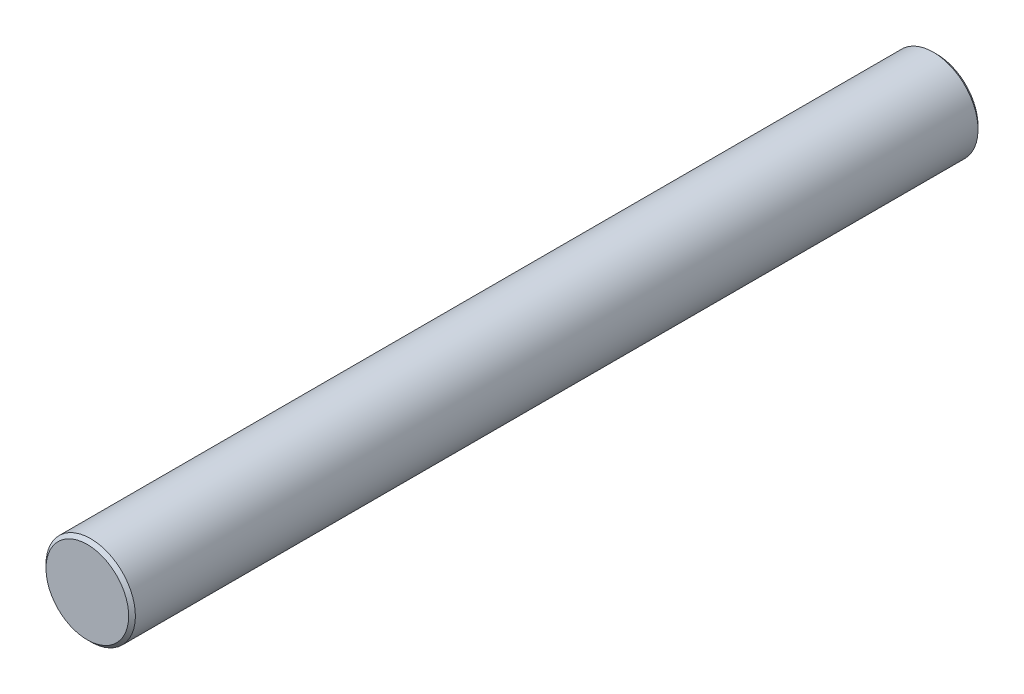
ISO-10303-21;
HEADER;
FILE_DESCRIPTION(('STEP AP214'),'2;1');
FILE_NAME('part.step','',(''),(''),'','','');
FILE_SCHEMA(('AUTOMOTIVE_DESIGN { 1 0 10303 214 1 1 1 1 }'));
ENDSEC;
DATA;
#1=APPLICATION_CONTEXT('core data for automotive mechanical design processes');
#2=APPLICATION_PROTOCOL_DEFINITION('international standard','automotive_design',2000,#1);
#3=PRODUCT_CONTEXT('',#1,'mechanical');
#4=PRODUCT('Part','Part','',(#3));
#5=PRODUCT_RELATED_PRODUCT_CATEGORY('part','',(#4));
#6=PRODUCT_DEFINITION_FORMATION('','',#4);
#7=PRODUCT_DEFINITION_CONTEXT('part definition',#1,'design');
#8=PRODUCT_DEFINITION('design','',#6,#7);
#9=PRODUCT_DEFINITION_SHAPE('','',#8);
#10=(LENGTH_UNIT() NAMED_UNIT(*) SI_UNIT(.MILLI.,.METRE.));
#11=(NAMED_UNIT(*) PLANE_ANGLE_UNIT() SI_UNIT($,.RADIAN.));
#12=(NAMED_UNIT(*) SI_UNIT($,.STERADIAN.) SOLID_ANGLE_UNIT());
#13=UNCERTAINTY_MEASURE_WITH_UNIT(LENGTH_MEASURE(1.E-05),#10,'distance_accuracy_value','');
#14=(GEOMETRIC_REPRESENTATION_CONTEXT(3) GLOBAL_UNCERTAINTY_ASSIGNED_CONTEXT((#13)) GLOBAL_UNIT_ASSIGNED_CONTEXT((#10,
#11,#12)) REPRESENTATION_CONTEXT('',''));
#15=CARTESIAN_POINT('',(0.,0.,0.));
#16=DIRECTION('',(0.,0.,1.));
#17=DIRECTION('',(1.,0.,0.));
#18=AXIS2_PLACEMENT_3D('',#15,#16,#17);
#19=CARTESIAN_POINT('',(0.,9.25,0.));
#20=DIRECTION('',(0.,0.,-1.));
#21=DIRECTION('',(0.,1.,0.));
#22=AXIS2_PLACEMENT_3D('',#19,#20,#21);
#23=PLANE('',#22);
#24=CARTESIAN_POINT('',(0.,0.,0.));
#25=DIRECTION('',(0.,0.,-1.));
#26=DIRECTION('',(0.,1.,0.));
#27=AXIS2_PLACEMENT_3D('',#24,#25,#26);
#28=CIRCLE('',#27,18.5);
#29=CARTESIAN_POINT('',(0.,18.5,0.));
#30=VERTEX_POINT('',#29);
#31=EDGE_CURVE('E9',#30,#30,#28,.T.);
#32=ORIENTED_EDGE('',*,*,#31,.T.);
#33=EDGE_LOOP('',(#32));
#34=FACE_BOUND('',#33,.T.);
#35=CARTESIAN_POINT('',(0.,0.,0.));
#36=DIRECTION('',(0.,0.,1.));
#37=DIRECTION('',(-1.,0.,0.));
#38=AXIS2_PLACEMENT_3D('',#35,#36,#37);
#39=CIRCLE('',#38,6.);
#40=CARTESIAN_POINT('',(-6.,0.,0.));
#41=VERTEX_POINT('',#40);
#42=EDGE_CURVE('E52',#41,#41,#39,.T.);
#43=ORIENTED_EDGE('',*,*,#42,.T.);
#44=EDGE_LOOP('',(#43));
#45=FACE_BOUND('',#44,.T.);
#46=ADVANCED_FACE('F15',(#34,#45),#23,.T.);
#47=CARTESIAN_POINT('',(0.,0.,0.75));
#48=DIRECTION('',(0.,0.,1.));
#49=DIRECTION('',(0.,1.,0.));
#50=AXIS2_PLACEMENT_3D('',#47,#48,#49);
#51=CONICAL_SURFACE('',#50,19.25,0.785398163397448);
#52=CARTESIAN_POINT('',(0.,0.,1.5));
#53=DIRECTION('',(0.,0.,-1.));
#54=DIRECTION('',(0.,1.,0.));
#55=AXIS2_PLACEMENT_3D('',#52,#53,#54);
#56=CIRCLE('',#55,20.);
#57=CARTESIAN_POINT('',(0.,20.,1.5));
#58=VERTEX_POINT('',#57);
#59=EDGE_CURVE('E25',#58,#58,#56,.T.);
#60=ORIENTED_EDGE('',*,*,#59,.T.);
#61=EDGE_LOOP('',(#60));
#62=FACE_BOUND('',#61,.T.);
#63=ORIENTED_EDGE('',*,*,#31,.F.);
#64=EDGE_LOOP('',(#63));
#65=FACE_BOUND('',#64,.T.);
#66=ADVANCED_FACE('F121',(#62,#65),#51,.T.);
#67=CARTESIAN_POINT('',(0.,0.,190.));
#68=DIRECTION('',(0.,0.,1.));
#69=DIRECTION('',(0.,1.,0.));
#70=AXIS2_PLACEMENT_3D('',#67,#68,#69);
#71=CYLINDRICAL_SURFACE('',#70,20.);
#72=CARTESIAN_POINT('',(0.,0.,378.5));
#73=DIRECTION('',(0.,0.,-1.));
#74=DIRECTION('',(0.,1.,0.));
#75=AXIS2_PLACEMENT_3D('',#72,#73,#74);
#76=CIRCLE('',#75,20.);
#77=CARTESIAN_POINT('',(0.,20.,378.5));
#78=VERTEX_POINT('',#77);
#79=EDGE_CURVE('E19',#78,#78,#76,.T.);
#80=ORIENTED_EDGE('',*,*,#79,.T.);
#81=EDGE_LOOP('',(#80));
#82=FACE_BOUND('',#81,.T.);
#83=ORIENTED_EDGE('',*,*,#59,.F.);
#84=EDGE_LOOP('',(#83));
#85=FACE_BOUND('',#84,.T.);
#86=CARTESIAN_POINT('',(0.,0.,6.5));
#87=DIRECTION('',(0.,0.,-1.));
#88=DIRECTION('',(0.,1.,0.));
#89=AXIS2_PLACEMENT_3D('',#86,#87,#88);
#90=CIRCLE('',#89,20.);
#91=CARTESIAN_POINT('',(10.5356537528527,-17.,6.5));
#92=VERTEX_POINT('',#91);
#93=CARTESIAN_POINT('',(-10.5356537528527,-17.,6.5));
#94=VERTEX_POINT('',#93);
#95=EDGE_CURVE('E69',#92,#94,#90,.T.);
#96=ORIENTED_EDGE('',*,*,#95,.T.);
#97=DIRECTION('',(0.,0.,1.));
#98=VECTOR('',#97,1.);
#99=CARTESIAN_POINT('',(-10.5356537528527,-17.,8.25));
#100=LINE('',#99,#98);
#101=CARTESIAN_POINT('',(-10.5356537528527,-17.,10.));
#102=VERTEX_POINT('',#101);
#103=EDGE_CURVE('E62',#94,#102,#100,.T.);
#104=ORIENTED_EDGE('',*,*,#103,.T.);
#105=CARTESIAN_POINT('',(0.,0.,10.));
#106=DIRECTION('',(0.,0.,1.));
#107=DIRECTION('',(0.,1.,0.));
#108=AXIS2_PLACEMENT_3D('',#105,#106,#107);
#109=CIRCLE('',#108,20.);
#110=CARTESIAN_POINT('',(10.5356537528527,-17.,10.));
#111=VERTEX_POINT('',#110);
#112=EDGE_CURVE('E75',#102,#111,#109,.T.);
#113=ORIENTED_EDGE('',*,*,#112,.T.);
#114=DIRECTION('',(0.,0.,-1.));
#115=VECTOR('',#114,1.);
#116=CARTESIAN_POINT('',(10.5356537528527,-17.,8.25));
#117=LINE('',#116,#115);
#118=EDGE_CURVE('E60',#111,#92,#117,.T.);
#119=ORIENTED_EDGE('',*,*,#118,.T.);
#120=EDGE_LOOP('',(#96,#104,#113,#119));
#121=FACE_BOUND('',#120,.T.);
#122=ADVANCED_FACE('F17',(#82,#85,#121),#71,.T.);
#123=CARTESIAN_POINT('',(0.,0.,379.25));
#124=DIRECTION('',(0.,0.,-1.));
#125=DIRECTION('',(0.,1.,0.));
#126=AXIS2_PLACEMENT_3D('',#123,#124,#125);
#127=CONICAL_SURFACE('',#126,19.25,0.785398163397448);
#128=CARTESIAN_POINT('',(0.,0.,380.));
#129=DIRECTION('',(0.,0.,-1.));
#130=DIRECTION('',(0.,1.,0.));
#131=AXIS2_PLACEMENT_3D('',#128,#129,#130);
#132=CIRCLE('',#131,18.5);
#133=CARTESIAN_POINT('',(0.,18.5,380.));
#134=VERTEX_POINT('',#133);
#135=EDGE_CURVE('E44',#134,#134,#132,.T.);
#136=ORIENTED_EDGE('',*,*,#135,.T.);
#137=EDGE_LOOP('',(#136));
#138=FACE_BOUND('',#137,.T.);
#139=ORIENTED_EDGE('',*,*,#79,.F.);
#140=EDGE_LOOP('',(#139));
#141=FACE_BOUND('',#140,.T.);
#142=ADVANCED_FACE('F116',(#138,#141),#127,.T.);
#143=CARTESIAN_POINT('',(0.,9.25,380.));
#144=DIRECTION('',(0.,0.,1.));
#145=DIRECTION('',(0.,-1.,0.));
#146=AXIS2_PLACEMENT_3D('',#143,#144,#145);
#147=PLANE('',#146);
#148=ORIENTED_EDGE('',*,*,#135,.F.);
#149=EDGE_LOOP('',(#148));
#150=FACE_BOUND('',#149,.T.);
#151=ADVANCED_FACE('F110',(#150),#147,.T.);
#152=CARTESIAN_POINT('',(0.,0.,26.4586213285198));
#153=DIRECTION('',(0.,0.,-1.));
#154=DIRECTION('',(-1.,0.,0.));
#155=AXIS2_PLACEMENT_3D('',#152,#153,#154);
#156=CONICAL_SURFACE('',#155,2.52640625,1.0471975511966);
#157=CARTESIAN_POINT('',(0.,0.,25.));
#158=DIRECTION('',(0.,0.,1.));
#159=DIRECTION('',(-1.,0.,0.));
#160=AXIS2_PLACEMENT_3D('',#157,#158,#159);
#161=CIRCLE('',#160,5.0528125);
#162=CARTESIAN_POINT('',(-5.0528125,0.,25.));
#163=VERTEX_POINT('',#162);
#164=EDGE_CURVE('E51',#163,#163,#161,.T.);
#165=ORIENTED_EDGE('',*,*,#164,.F.);
#166=EDGE_LOOP('',(#165));
#167=FACE_BOUND('',#166,.T.);
#168=CARTESIAN_POINT('',(0.,0.,27.9172426570397));
#169=VERTEX_POINT('',#168);
#170=VERTEX_LOOP('',#169);
#171=FACE_BOUND('',#170,.T.);
#172=ADVANCED_FACE('F104',(#167,#171),#156,.F.);
#173=CARTESIAN_POINT('',(0.,0.,12.97359375));
#174=DIRECTION('',(0.,0.,-1.));
#175=DIRECTION('',(-1.,0.,0.));
#176=AXIS2_PLACEMENT_3D('',#173,#174,#175);
#177=CYLINDRICAL_SURFACE('',#176,5.0528125);
#178=CARTESIAN_POINT('',(0.,0.,0.9471875));
#179=DIRECTION('',(0.,0.,1.));
#180=DIRECTION('',(-1.,0.,0.));
#181=AXIS2_PLACEMENT_3D('',#178,#179,#180);
#182=CIRCLE('',#181,5.0528125);
#183=CARTESIAN_POINT('',(-5.0528125,0.,0.9471875));
#184=VERTEX_POINT('',#183);
#185=EDGE_CURVE('E57',#184,#184,#182,.T.);
#186=ORIENTED_EDGE('',*,*,#185,.F.);
#187=EDGE_LOOP('',(#186));
#188=FACE_BOUND('',#187,.T.);
#189=ORIENTED_EDGE('',*,*,#164,.T.);
#190=EDGE_LOOP('',(#189));
#191=FACE_BOUND('',#190,.T.);
#192=ADVANCED_FACE('F101',(#188,#191),#177,.F.);
#193=CARTESIAN_POINT('',(0.,0.,0.47359375));
#194=DIRECTION('',(0.,0.,-1.));
#195=DIRECTION('',(-1.,0.,0.));
#196=AXIS2_PLACEMENT_3D('',#193,#194,#195);
#197=CONICAL_SURFACE('',#196,5.52640625,0.785398163397448);
#198=ORIENTED_EDGE('',*,*,#42,.F.);
#199=EDGE_LOOP('',(#198));
#200=FACE_BOUND('',#199,.T.);
#201=ORIENTED_EDGE('',*,*,#185,.T.);
#202=EDGE_LOOP('',(#201));
#203=FACE_BOUND('',#202,.T.);
#204=ADVANCED_FACE('F99',(#200,#203),#197,.F.);
#205=CARTESIAN_POINT('',(0.,-17.,8.25));
#206=DIRECTION('',(0.,-1.,0.));
#207=DIRECTION('',(0.,0.,-1.));
#208=AXIS2_PLACEMENT_3D('',#205,#206,#207);
#209=PLANE('',#208);
#210=ORIENTED_EDGE('',*,*,#103,.F.);
#211=DIRECTION('',(1.,0.,0.));
#212=VECTOR('',#211,1.);
#213=CARTESIAN_POINT('',(0.,-17.,6.5));
#214=LINE('',#213,#212);
#215=EDGE_CURVE('E66',#94,#92,#214,.T.);
#216=ORIENTED_EDGE('',*,*,#215,.T.);
#217=ORIENTED_EDGE('',*,*,#118,.F.);
#218=DIRECTION('',(-1.,0.,0.));
#219=VECTOR('',#218,1.);
#220=CARTESIAN_POINT('',(0.,-17.,10.));
#221=LINE('',#220,#219);
#222=EDGE_CURVE('E72',#111,#102,#221,.T.);
#223=ORIENTED_EDGE('',*,*,#222,.T.);
#224=EDGE_LOOP('',(#210,#216,#217,#223));
#225=FACE_BOUND('',#224,.T.);
#226=ADVANCED_FACE('F131',(#225),#209,.T.);
#227=CARTESIAN_POINT('',(0.,-19.5,6.5));
#228=DIRECTION('',(0.,0.,1.));
#229=DIRECTION('',(1.,0.,0.));
#230=AXIS2_PLACEMENT_3D('',#227,#228,#229);
#231=PLANE('',#230);
#232=ORIENTED_EDGE('',*,*,#95,.F.);
#233=ORIENTED_EDGE('',*,*,#215,.F.);
#234=EDGE_LOOP('',(#232,#233));
#235=FACE_BOUND('',#234,.T.);
#236=ADVANCED_FACE('F135',(#235),#231,.T.);
#237=CARTESIAN_POINT('',(0.,-19.5,10.));
#238=DIRECTION('',(0.,0.,1.));
#239=DIRECTION('',(1.,0.,0.));
#240=AXIS2_PLACEMENT_3D('',#237,#238,#239);
#241=PLANE('',#240);
#242=ORIENTED_EDGE('',*,*,#112,.F.);
#243=ORIENTED_EDGE('',*,*,#222,.F.);
#244=EDGE_LOOP('',(#242,#243));
#245=FACE_BOUND('',#244,.T.);
#246=ADVANCED_FACE('F87',(#245),#241,.F.);
#247=CLOSED_SHELL('',(#46,#66,#122,#142,#151,#172,#192,#204,#226,#236,#246));
#248=MANIFOLD_SOLID_BREP('B1',#247);
#249=ADVANCED_BREP_SHAPE_REPRESENTATION('',(#18,#248),#14);
#250=SHAPE_DEFINITION_REPRESENTATION(#9,#249);
ENDSEC;
END-ISO-10303-21;
